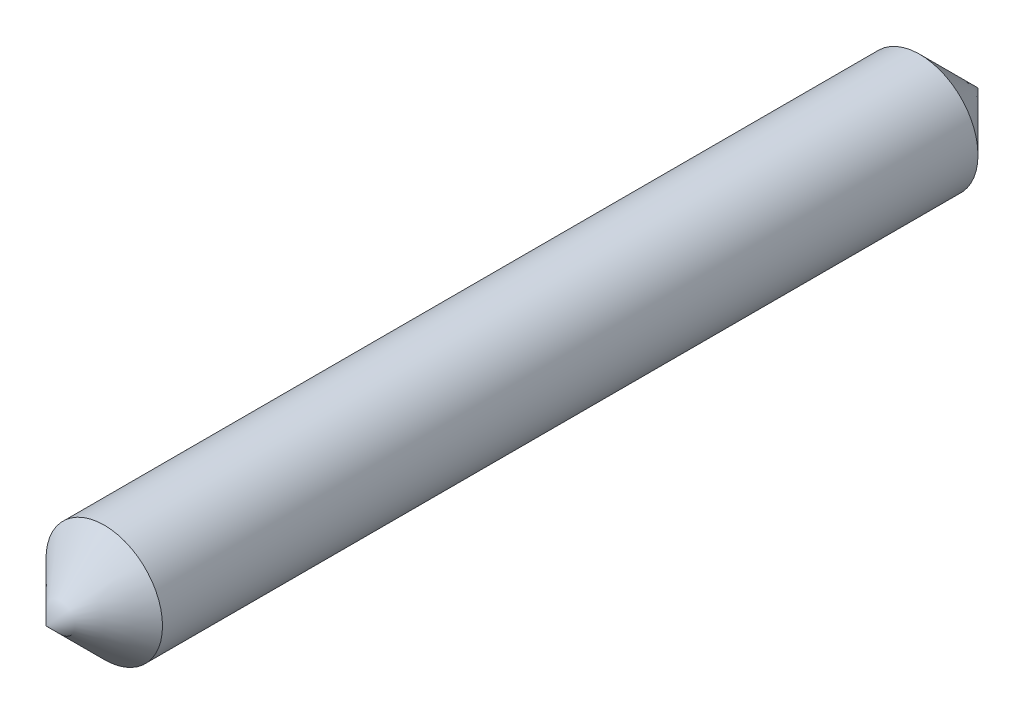
ISO-10303-21;
HEADER;
FILE_DESCRIPTION(('STEP AP214'),'2;1');
FILE_NAME('part.step','',(''),(''),'','','');
FILE_SCHEMA(('AUTOMOTIVE_DESIGN { 1 0 10303 214 1 1 1 1 }'));
ENDSEC;
DATA;
#1=APPLICATION_CONTEXT('core data for automotive mechanical design processes');
#2=APPLICATION_PROTOCOL_DEFINITION('international standard','automotive_design',2000,#1);
#3=PRODUCT_CONTEXT('',#1,'mechanical');
#4=PRODUCT('Part','Part','',(#3));
#5=PRODUCT_RELATED_PRODUCT_CATEGORY('part','',(#4));
#6=PRODUCT_DEFINITION_FORMATION('','',#4);
#7=PRODUCT_DEFINITION_CONTEXT('part definition',#1,'design');
#8=PRODUCT_DEFINITION('design','',#6,#7);
#9=PRODUCT_DEFINITION_SHAPE('','',#8);
#10=(LENGTH_UNIT() NAMED_UNIT(*) SI_UNIT(.MILLI.,.METRE.));
#11=(NAMED_UNIT(*) PLANE_ANGLE_UNIT() SI_UNIT($,.RADIAN.));
#12=(NAMED_UNIT(*) SI_UNIT($,.STERADIAN.) SOLID_ANGLE_UNIT());
#13=UNCERTAINTY_MEASURE_WITH_UNIT(LENGTH_MEASURE(1.E-05),#10,'distance_accuracy_value','');
#14=(GEOMETRIC_REPRESENTATION_CONTEXT(3) GLOBAL_UNCERTAINTY_ASSIGNED_CONTEXT((#13)) GLOBAL_UNIT_ASSIGNED_CONTEXT((#10,
#11,#12)) REPRESENTATION_CONTEXT('',''));
#15=CARTESIAN_POINT('',(0.,0.,0.));
#16=DIRECTION('',(0.,0.,1.));
#17=DIRECTION('',(1.,0.,0.));
#18=AXIS2_PLACEMENT_3D('',#15,#16,#17);
#19=CARTESIAN_POINT('',(0.,0.,10.));
#20=DIRECTION('',(0.,0.,-1.));
#21=DIRECTION('',(-1.,0.,0.));
#22=AXIS2_PLACEMENT_3D('',#19,#20,#21);
#23=CYLINDRICAL_SURFACE('',#22,0.625);
#24=CARTESIAN_POINT('',(0.,0.,0.624999999999999));
#25=DIRECTION('',(0.,0.,1.));
#26=DIRECTION('',(1.,0.,0.));
#27=AXIS2_PLACEMENT_3D('',#24,#25,#26);
#28=CIRCLE('',#27,0.625);
#29=CARTESIAN_POINT('',(0.625,0.,0.624999999999999));
#30=VERTEX_POINT('',#29);
#31=EDGE_CURVE('E11',#30,#30,#28,.T.);
#32=ORIENTED_EDGE('',*,*,#31,.T.);
#33=EDGE_LOOP('',(#32));
#34=FACE_BOUND('',#33,.T.);
#35=CARTESIAN_POINT('',(0.,0.,9.375));
#36=DIRECTION('',(0.,0.,1.));
#37=DIRECTION('',(1.,0.,0.));
#38=AXIS2_PLACEMENT_3D('',#35,#36,#37);
#39=CIRCLE('',#38,0.625);
#40=CARTESIAN_POINT('',(0.625,0.,9.375));
#41=VERTEX_POINT('',#40);
#42=EDGE_CURVE('E41',#41,#41,#39,.F.);
#43=ORIENTED_EDGE('',*,*,#42,.T.);
#44=EDGE_LOOP('',(#43));
#45=FACE_BOUND('',#44,.T.);
#46=ADVANCED_FACE('F32',(#34,#45),#23,.T.);
#47=CARTESIAN_POINT('',(0.,0.,0.624999999999999));
#48=DIRECTION('',(0.,0.,1.));
#49=DIRECTION('',(1.,0.,0.));
#50=AXIS2_PLACEMENT_3D('',#47,#48,#49);
#51=CONICAL_SURFACE('',#50,0.625000000000002,0.785398163397451);
#52=CARTESIAN_POINT('',(0.,0.,0.));
#53=VERTEX_POINT('',#52);
#54=VERTEX_LOOP('',#53);
#55=FACE_BOUND('',#54,.T.);
#56=ORIENTED_EDGE('',*,*,#31,.F.);
#57=EDGE_LOOP('',(#56));
#58=FACE_BOUND('',#57,.T.);
#59=ADVANCED_FACE('F47',(#55,#58),#51,.T.);
#60=CARTESIAN_POINT('',(0.,0.,9.375));
#61=DIRECTION('',(0.,0.,-1.));
#62=DIRECTION('',(-1.,0.,0.));
#63=AXIS2_PLACEMENT_3D('',#60,#61,#62);
#64=CONICAL_SURFACE('',#63,0.625,0.785398163397447);
#65=ORIENTED_EDGE('',*,*,#42,.F.);
#66=EDGE_LOOP('',(#65));
#67=FACE_BOUND('',#66,.T.);
#68=CARTESIAN_POINT('',(0.,0.,10.));
#69=VERTEX_POINT('',#68);
#70=VERTEX_LOOP('',#69);
#71=FACE_BOUND('',#70,.T.);
#72=ADVANCED_FACE('F34',(#67,#71),#64,.T.);
#73=CLOSED_SHELL('',(#46,#59,#72));
#74=MANIFOLD_SOLID_BREP('B2',#73);
#75=ADVANCED_BREP_SHAPE_REPRESENTATION('',(#18,#74),#14);
#76=SHAPE_DEFINITION_REPRESENTATION(#9,#75);
ENDSEC;
END-ISO-10303-21;
